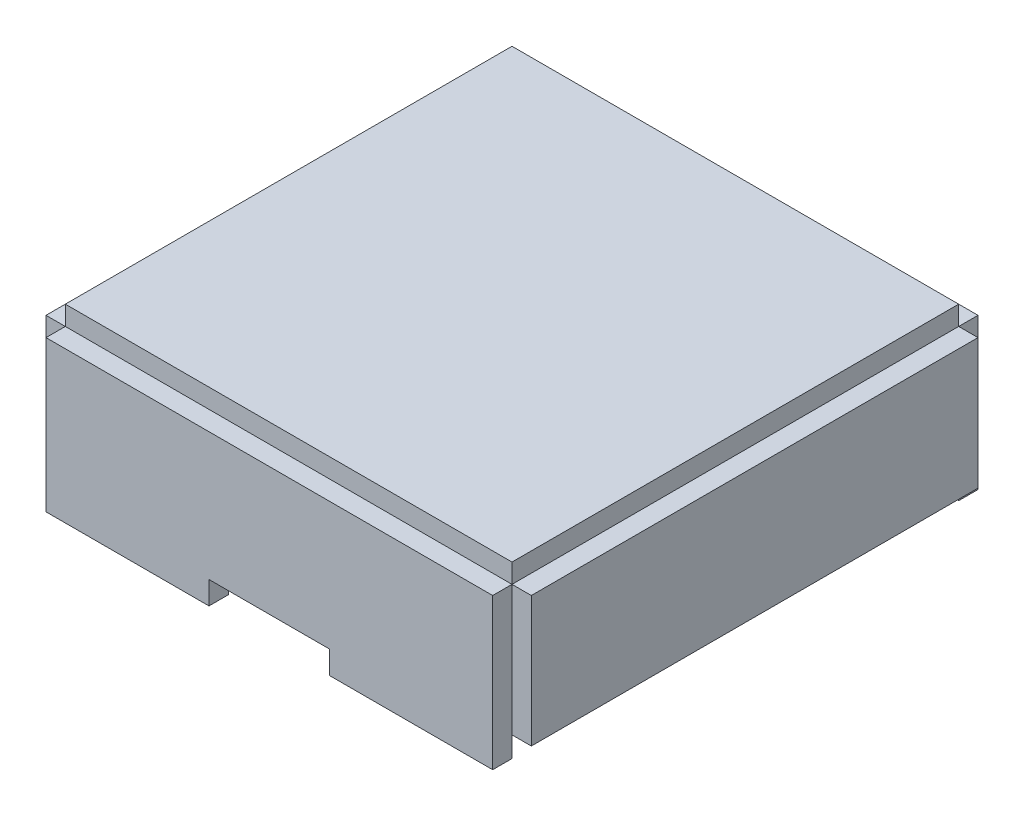
ISO-10303-21;
HEADER;
FILE_DESCRIPTION(('STEP AP214'),'2;1');
FILE_NAME('part.step','',(''),(''),'','','');
FILE_SCHEMA(('AUTOMOTIVE_DESIGN { 1 0 10303 214 1 1 1 1 }'));
ENDSEC;
DATA;
#1=APPLICATION_CONTEXT('core data for automotive mechanical design processes');
#2=APPLICATION_PROTOCOL_DEFINITION('international standard','automotive_design',2000,#1);
#3=PRODUCT_CONTEXT('',#1,'mechanical');
#4=PRODUCT('Part','Part','',(#3));
#5=PRODUCT_RELATED_PRODUCT_CATEGORY('part','',(#4));
#6=PRODUCT_DEFINITION_FORMATION('','',#4);
#7=PRODUCT_DEFINITION_CONTEXT('part definition',#1,'design');
#8=PRODUCT_DEFINITION('design','',#6,#7);
#9=PRODUCT_DEFINITION_SHAPE('','',#8);
#10=(LENGTH_UNIT() NAMED_UNIT(*) SI_UNIT(.MILLI.,.METRE.));
#11=(NAMED_UNIT(*) PLANE_ANGLE_UNIT() SI_UNIT($,.RADIAN.));
#12=(NAMED_UNIT(*) SI_UNIT($,.STERADIAN.) SOLID_ANGLE_UNIT());
#13=UNCERTAINTY_MEASURE_WITH_UNIT(LENGTH_MEASURE(1.E-05),#10,'distance_accuracy_value','');
#14=(GEOMETRIC_REPRESENTATION_CONTEXT(3) GLOBAL_UNCERTAINTY_ASSIGNED_CONTEXT((#13)) GLOBAL_UNIT_ASSIGNED_CONTEXT((#10,
#11,#12)) REPRESENTATION_CONTEXT('',''));
#15=CARTESIAN_POINT('',(0.,0.,0.));
#16=DIRECTION('',(0.,0.,1.));
#17=DIRECTION('',(1.,0.,0.));
#18=AXIS2_PLACEMENT_3D('',#15,#16,#17);
#19=CARTESIAN_POINT('',(0.,-31.75,0.));
#20=DIRECTION('',(0.,-1.,0.));
#21=DIRECTION('',(0.,0.,-1.));
#22=AXIS2_PLACEMENT_3D('',#19,#20,#21);
#23=PLANE('',#22);
#24=DIRECTION('',(0.,0.,1.));
#25=VECTOR('',#24,1.);
#26=CARTESIAN_POINT('',(-24.8920000000006,-31.75,114.3));
#27=LINE('',#26,#25);
#28=CARTESIAN_POINT('',(-24.8920000000006,-31.75,110.236));
#29=VERTEX_POINT('',#28);
#30=CARTESIAN_POINT('',(-24.8920000000006,-31.75,114.3));
#31=VERTEX_POINT('',#30);
#32=EDGE_CURVE('E129',#29,#31,#27,.T.);
#33=ORIENTED_EDGE('',*,*,#32,.F.);
#34=DIRECTION('',(1.,0.,0.));
#35=VECTOR('',#34,1.);
#36=CARTESIAN_POINT('',(0.,-31.75,110.236));
#37=LINE('',#36,#35);
#38=CARTESIAN_POINT('',(9.39799999999882,-31.75,110.236));
#39=VERTEX_POINT('',#38);
#40=EDGE_CURVE('E159',#29,#39,#37,.T.);
#41=ORIENTED_EDGE('',*,*,#40,.T.);
#42=DIRECTION('',(0.,0.,1.));
#43=VECTOR('',#42,1.);
#44=CARTESIAN_POINT('',(9.3979999999988,-31.75,0.));
#45=LINE('',#44,#43);
#46=CARTESIAN_POINT('',(9.39799999999882,-31.75,114.3));
#47=VERTEX_POINT('',#46);
#48=EDGE_CURVE('E162',#39,#47,#45,.T.);
#49=ORIENTED_EDGE('',*,*,#48,.T.);
#50=DIRECTION('',(1.,0.,0.));
#51=VECTOR('',#50,1.);
#52=CARTESIAN_POINT('',(0.,-31.75,114.3));
#53=LINE('',#52,#51);
#54=EDGE_CURVE('E165',#31,#47,#53,.T.);
#55=ORIENTED_EDGE('',*,*,#54,.F.);
#56=EDGE_LOOP('',(#33,#41,#49,#55));
#57=FACE_BOUND('',#56,.T.);
#58=ADVANCED_FACE('F50',(#57),#23,.T.);
#59=CARTESIAN_POINT('',(-84.5820000000005,-31.75,0.));
#60=DIRECTION('',(1.,0.,0.));
#61=DIRECTION('',(0.,0.,-1.));
#62=AXIS2_PLACEMENT_3D('',#59,#60,#61);
#63=PLANE('',#62);
#64=DIRECTION('',(0.,0.,-1.));
#65=VECTOR('',#64,1.);
#66=CARTESIAN_POINT('',(-84.5820000000005,0.,0.));
#67=LINE('',#66,#65);
#68=CARTESIAN_POINT('',(-84.5820000000004,0.,114.3));
#69=VERTEX_POINT('',#68);
#70=CARTESIAN_POINT('',(-84.5820000000004,0.,110.236));
#71=VERTEX_POINT('',#70);
#72=EDGE_CURVE('E153',#69,#71,#67,.T.);
#73=ORIENTED_EDGE('',*,*,#72,.T.);
#74=DIRECTION('',(0.,1.,0.));
#75=VECTOR('',#74,1.);
#76=CARTESIAN_POINT('',(-84.5820000000004,-31.75,110.236));
#77=LINE('',#76,#75);
#78=CARTESIAN_POINT('',(-84.5820000000004,-31.75,110.236));
#79=VERTEX_POINT('',#78);
#80=EDGE_CURVE('E12',#79,#71,#77,.T.);
#81=ORIENTED_EDGE('',*,*,#80,.F.);
#82=DIRECTION('',(0.,0.,-1.));
#83=VECTOR('',#82,1.);
#84=CARTESIAN_POINT('',(-84.5820000000005,-31.75,0.));
#85=LINE('',#84,#83);
#86=CARTESIAN_POINT('',(-84.5820000000004,-31.75,114.3));
#87=VERTEX_POINT('',#86);
#88=EDGE_CURVE('E157',#87,#79,#85,.T.);
#89=ORIENTED_EDGE('',*,*,#88,.F.);
#90=DIRECTION('',(0.,1.,0.));
#91=VECTOR('',#90,1.);
#92=CARTESIAN_POINT('',(-84.5820000000004,-31.75,114.3));
#93=LINE('',#92,#91);
#94=EDGE_CURVE('E74',#87,#69,#93,.T.);
#95=ORIENTED_EDGE('',*,*,#94,.T.);
#96=EDGE_LOOP('',(#73,#81,#89,#95));
#97=FACE_BOUND('',#96,.T.);
#98=ADVANCED_FACE('F52',(#97),#63,.F.);
#99=CARTESIAN_POINT('',(0.,-31.75,110.236));
#100=DIRECTION('',(0.,0.,1.));
#101=DIRECTION('',(1.,0.,0.));
#102=AXIS2_PLACEMENT_3D('',#99,#100,#101);
#103=PLANE('',#102);
#104=ORIENTED_EDGE('',*,*,#40,.F.);
#105=DIRECTION('',(0.,-1.,0.));
#106=VECTOR('',#105,1.);
#107=CARTESIAN_POINT('',(-24.8920000000006,-26.924,110.236));
#108=LINE('',#107,#106);
#109=CARTESIAN_POINT('',(-24.8920000000006,-26.924,110.236));
#110=VERTEX_POINT('',#109);
#111=EDGE_CURVE('E151',#110,#29,#108,.T.);
#112=ORIENTED_EDGE('',*,*,#111,.F.);
#113=DIRECTION('',(1.,0.,0.));
#114=VECTOR('',#113,1.);
#115=CARTESIAN_POINT('',(-50.2920000000006,-26.924,110.236));
#116=LINE('',#115,#114);
#117=CARTESIAN_POINT('',(-50.2920000000006,-26.924,110.236));
#118=VERTEX_POINT('',#117);
#119=EDGE_CURVE('E132',#118,#110,#116,.T.);
#120=ORIENTED_EDGE('',*,*,#119,.F.);
#121=DIRECTION('',(0.,-1.,0.));
#122=VECTOR('',#121,1.);
#123=CARTESIAN_POINT('',(-50.2920000000006,-26.924,110.236));
#124=LINE('',#123,#122);
#125=CARTESIAN_POINT('',(-50.2920000000006,-31.75,110.236));
#126=VERTEX_POINT('',#125);
#127=EDGE_CURVE('E154',#118,#126,#124,.T.);
#128=ORIENTED_EDGE('',*,*,#127,.T.);
#129=EDGE_CURVE('E100',#79,#126,#37,.T.);
#130=ORIENTED_EDGE('',*,*,#129,.F.);
#131=ORIENTED_EDGE('',*,*,#80,.T.);
#132=DIRECTION('',(1.,0.,0.));
#133=VECTOR('',#132,1.);
#134=CARTESIAN_POINT('',(0.,0.,110.236));
#135=LINE('',#134,#133);
#136=CARTESIAN_POINT('',(9.39799999999882,0.,110.236));
#137=VERTEX_POINT('',#136);
#138=EDGE_CURVE('E169',#71,#137,#135,.T.);
#139=ORIENTED_EDGE('',*,*,#138,.T.);
#140=DIRECTION('',(0.,1.,0.));
#141=VECTOR('',#140,1.);
#142=CARTESIAN_POINT('',(9.39799999999882,-31.75,110.236));
#143=LINE('',#142,#141);
#144=EDGE_CURVE('E58',#39,#137,#143,.T.);
#145=ORIENTED_EDGE('',*,*,#144,.F.);
#146=EDGE_LOOP('',(#104,#112,#120,#128,#130,#131,#139,#145));
#147=FACE_BOUND('',#146,.T.);
#148=ADVANCED_FACE('F189',(#147),#103,.F.);
#149=CARTESIAN_POINT('',(9.3979999999988,-31.75,0.));
#150=DIRECTION('',(-1.,0.,0.));
#151=DIRECTION('',(0.,0.,1.));
#152=AXIS2_PLACEMENT_3D('',#149,#150,#151);
#153=PLANE('',#152);
#154=DIRECTION('',(0.,0.,1.));
#155=VECTOR('',#154,1.);
#156=CARTESIAN_POINT('',(9.3979999999988,0.,0.));
#157=LINE('',#156,#155);
#158=CARTESIAN_POINT('',(9.39799999999882,0.,114.3));
#159=VERTEX_POINT('',#158);
#160=EDGE_CURVE('E171',#137,#159,#157,.T.);
#161=ORIENTED_EDGE('',*,*,#160,.T.);
#162=DIRECTION('',(0.,1.,0.));
#163=VECTOR('',#162,1.);
#164=CARTESIAN_POINT('',(9.39799999999882,-31.75,114.3));
#165=LINE('',#164,#163);
#166=EDGE_CURVE('E177',#47,#159,#165,.T.);
#167=ORIENTED_EDGE('',*,*,#166,.F.);
#168=ORIENTED_EDGE('',*,*,#48,.F.);
#169=ORIENTED_EDGE('',*,*,#144,.T.);
#170=EDGE_LOOP('',(#161,#167,#168,#169));
#171=FACE_BOUND('',#170,.T.);
#172=ADVANCED_FACE('F183',(#171),#153,.F.);
#173=CARTESIAN_POINT('',(0.,-31.75,114.3));
#174=DIRECTION('',(0.,0.,1.));
#175=DIRECTION('',(1.,0.,0.));
#176=AXIS2_PLACEMENT_3D('',#173,#174,#175);
#177=PLANE('',#176);
#178=DIRECTION('',(0.,-1.,0.));
#179=VECTOR('',#178,1.);
#180=CARTESIAN_POINT('',(-24.8920000000006,-26.924,114.3));
#181=LINE('',#180,#179);
#182=CARTESIAN_POINT('',(-24.8920000000006,-26.924,114.3));
#183=VERTEX_POINT('',#182);
#184=EDGE_CURVE('E123',#183,#31,#181,.T.);
#185=ORIENTED_EDGE('',*,*,#184,.T.);
#186=ORIENTED_EDGE('',*,*,#54,.T.);
#187=ORIENTED_EDGE('',*,*,#166,.T.);
#188=DIRECTION('',(1.,0.,0.));
#189=VECTOR('',#188,1.);
#190=CARTESIAN_POINT('',(0.,0.,114.3));
#191=LINE('',#190,#189);
#192=EDGE_CURVE('E160',#69,#159,#191,.T.);
#193=ORIENTED_EDGE('',*,*,#192,.F.);
#194=ORIENTED_EDGE('',*,*,#94,.F.);
#195=CARTESIAN_POINT('',(-50.2920000000006,-31.75,114.3));
#196=VERTEX_POINT('',#195);
#197=EDGE_CURVE('E166',#87,#196,#53,.T.);
#198=ORIENTED_EDGE('',*,*,#197,.T.);
#199=DIRECTION('',(0.,-1.,0.));
#200=VECTOR('',#199,1.);
#201=CARTESIAN_POINT('',(-50.2920000000006,-26.924,114.3));
#202=LINE('',#201,#200);
#203=CARTESIAN_POINT('',(-50.2920000000006,-26.924,114.3));
#204=VERTEX_POINT('',#203);
#205=EDGE_CURVE('E65',#204,#196,#202,.T.);
#206=ORIENTED_EDGE('',*,*,#205,.F.);
#207=DIRECTION('',(-1.,0.,0.));
#208=VECTOR('',#207,1.);
#209=CARTESIAN_POINT('',(-50.2920000000006,-26.924,114.3));
#210=LINE('',#209,#208);
#211=EDGE_CURVE('E138',#183,#204,#210,.T.);
#212=ORIENTED_EDGE('',*,*,#211,.F.);
#213=EDGE_LOOP('',(#185,#186,#187,#193,#194,#198,#206,#212));
#214=FACE_BOUND('',#213,.T.);
#215=ADVANCED_FACE('F143',(#214),#177,.T.);
#216=DIRECTION('',(0.,0.,-1.));
#217=VECTOR('',#216,1.);
#218=CARTESIAN_POINT('',(-50.2920000000006,-31.75,114.3));
#219=LINE('',#218,#217);
#220=EDGE_CURVE('E141',#196,#126,#219,.T.);
#221=ORIENTED_EDGE('',*,*,#220,.F.);
#222=ORIENTED_EDGE('',*,*,#197,.F.);
#223=ORIENTED_EDGE('',*,*,#88,.T.);
#224=ORIENTED_EDGE('',*,*,#129,.T.);
#225=EDGE_LOOP('',(#221,#222,#223,#224));
#226=FACE_BOUND('',#225,.T.);
#227=ADVANCED_FACE('F191',(#226),#23,.T.);
#228=CARTESIAN_POINT('',(0.,0.,0.));
#229=DIRECTION('',(0.,-1.,0.));
#230=DIRECTION('',(0.,0.,-1.));
#231=AXIS2_PLACEMENT_3D('',#228,#229,#230);
#232=PLANE('',#231);
#233=ORIENTED_EDGE('',*,*,#72,.F.);
#234=ORIENTED_EDGE('',*,*,#192,.T.);
#235=ORIENTED_EDGE('',*,*,#160,.F.);
#236=ORIENTED_EDGE('',*,*,#138,.F.);
#237=EDGE_LOOP('',(#233,#234,#235,#236));
#238=FACE_BOUND('',#237,.T.);
#239=ADVANCED_FACE('F187',(#238),#232,.F.);
#240=CARTESIAN_POINT('',(-24.8920000000006,-26.924,114.3));
#241=DIRECTION('',(1.,0.,0.));
#242=DIRECTION('',(0.,0.,-1.));
#243=AXIS2_PLACEMENT_3D('',#240,#241,#242);
#244=PLANE('',#243);
#245=ORIENTED_EDGE('',*,*,#32,.T.);
#246=ORIENTED_EDGE('',*,*,#184,.F.);
#247=DIRECTION('',(0.,0.,1.));
#248=VECTOR('',#247,1.);
#249=CARTESIAN_POINT('',(-24.8920000000006,-26.924,114.3));
#250=LINE('',#249,#248);
#251=EDGE_CURVE('E126',#110,#183,#250,.T.);
#252=ORIENTED_EDGE('',*,*,#251,.F.);
#253=ORIENTED_EDGE('',*,*,#111,.T.);
#254=EDGE_LOOP('',(#245,#246,#252,#253));
#255=FACE_BOUND('',#254,.T.);
#256=ADVANCED_FACE('F125',(#255),#244,.F.);
#257=CARTESIAN_POINT('',(-50.2920000000006,-26.924,114.3));
#258=DIRECTION('',(-1.,0.,0.));
#259=DIRECTION('',(0.,0.,1.));
#260=AXIS2_PLACEMENT_3D('',#257,#258,#259);
#261=PLANE('',#260);
#262=ORIENTED_EDGE('',*,*,#220,.T.);
#263=ORIENTED_EDGE('',*,*,#127,.F.);
#264=DIRECTION('',(0.,0.,-1.));
#265=VECTOR('',#264,1.);
#266=CARTESIAN_POINT('',(-50.2920000000006,-26.924,114.3));
#267=LINE('',#266,#265);
#268=EDGE_CURVE('E144',#204,#118,#267,.T.);
#269=ORIENTED_EDGE('',*,*,#268,.F.);
#270=ORIENTED_EDGE('',*,*,#205,.T.);
#271=EDGE_LOOP('',(#262,#263,#269,#270));
#272=FACE_BOUND('',#271,.T.);
#273=ADVANCED_FACE('F243',(#272),#261,.F.);
#274=CARTESIAN_POINT('',(0.,-26.924,0.));
#275=DIRECTION('',(0.,-1.,0.));
#276=DIRECTION('',(0.,0.,-1.));
#277=AXIS2_PLACEMENT_3D('',#274,#275,#276);
#278=PLANE('',#277);
#279=ORIENTED_EDGE('',*,*,#251,.T.);
#280=ORIENTED_EDGE('',*,*,#211,.T.);
#281=ORIENTED_EDGE('',*,*,#268,.T.);
#282=ORIENTED_EDGE('',*,*,#119,.T.);
#283=EDGE_LOOP('',(#279,#280,#281,#282));
#284=FACE_BOUND('',#283,.T.);
#285=ADVANCED_FACE('F136',(#284),#278,.T.);
#286=CLOSED_SHELL('',(#58,#98,#148,#172,#215,#227,#239,#256,#273,#285));
#287=MANIFOLD_SOLID_BREP('B2',#286);
#288=CARTESIAN_POINT('',(13.4619999999988,-31.75,0.));
#289=DIRECTION('',(1.,0.,0.));
#290=DIRECTION('',(0.,0.,-1.));
#291=AXIS2_PLACEMENT_3D('',#288,#289,#290);
#292=PLANE('',#291);
#293=DIRECTION('',(0.,1.,0.));
#294=VECTOR('',#293,1.);
#295=CARTESIAN_POINT('',(13.4619999999988,-31.75,208.28));
#296=LINE('',#295,#294);
#297=CARTESIAN_POINT('',(13.4619999999988,-27.432,208.28));
#298=VERTEX_POINT('',#297);
#299=CARTESIAN_POINT('',(13.4619999999988,0.,208.28));
#300=VERTEX_POINT('',#299);
#301=EDGE_CURVE('E48',#298,#300,#296,.T.);
#302=ORIENTED_EDGE('',*,*,#301,.F.);
#303=DIRECTION('',(0.,0.,1.));
#304=VECTOR('',#303,1.);
#305=CARTESIAN_POINT('',(13.4619999999988,-27.432,114.3));
#306=LINE('',#305,#304);
#307=CARTESIAN_POINT('',(13.4619999999988,-27.432,114.3));
#308=VERTEX_POINT('',#307);
#309=EDGE_CURVE('E331',#308,#298,#306,.T.);
#310=ORIENTED_EDGE('',*,*,#309,.F.);
#311=DIRECTION('',(0.,1.,0.));
#312=VECTOR('',#311,1.);
#313=CARTESIAN_POINT('',(13.4619999999988,-31.75,114.3));
#314=LINE('',#313,#312);
#315=CARTESIAN_POINT('',(13.4619999999988,0.,114.3));
#316=VERTEX_POINT('',#315);
#317=EDGE_CURVE('E313',#308,#316,#314,.T.);
#318=ORIENTED_EDGE('',*,*,#317,.T.);
#319=DIRECTION('',(0.,0.,-1.));
#320=VECTOR('',#319,1.);
#321=CARTESIAN_POINT('',(13.4619999999988,0.,0.));
#322=LINE('',#321,#320);
#323=EDGE_CURVE('E360',#300,#316,#322,.T.);
#324=ORIENTED_EDGE('',*,*,#323,.F.);
#325=EDGE_LOOP('',(#302,#310,#318,#324));
#326=FACE_BOUND('',#325,.T.);
#327=ADVANCED_FACE('F291',(#326),#292,.T.);
#328=CARTESIAN_POINT('',(0.,-31.75,208.28));
#329=DIRECTION('',(0.,0.,-1.));
#330=DIRECTION('',(-1.,0.,0.));
#331=AXIS2_PLACEMENT_3D('',#328,#329,#330);
#332=PLANE('',#331);
#333=DIRECTION('',(-1.,0.,0.));
#334=VECTOR('',#333,1.);
#335=CARTESIAN_POINT('',(13.4619999999988,-27.432,208.28));
#336=LINE('',#335,#334);
#337=CARTESIAN_POINT('',(9.39799999999879,-27.432,208.28));
#338=VERTEX_POINT('',#337);
#339=EDGE_CURVE('E337',#298,#338,#336,.T.);
#340=ORIENTED_EDGE('',*,*,#339,.F.);
#341=ORIENTED_EDGE('',*,*,#301,.T.);
#342=DIRECTION('',(-1.,0.,0.));
#343=VECTOR('',#342,1.);
#344=CARTESIAN_POINT('',(0.,0.,208.28));
#345=LINE('',#344,#343);
#346=CARTESIAN_POINT('',(9.39799999999879,0.,208.28));
#347=VERTEX_POINT('',#346);
#348=EDGE_CURVE('E357',#300,#347,#345,.T.);
#349=ORIENTED_EDGE('',*,*,#348,.T.);
#350=DIRECTION('',(0.,1.,0.));
#351=VECTOR('',#350,1.);
#352=CARTESIAN_POINT('',(9.39799999999879,-31.75,208.28));
#353=LINE('',#352,#351);
#354=EDGE_CURVE('E298',#338,#347,#353,.T.);
#355=ORIENTED_EDGE('',*,*,#354,.F.);
#356=EDGE_LOOP('',(#340,#341,#349,#355));
#357=FACE_BOUND('',#356,.T.);
#358=ADVANCED_FACE('F358',(#357),#332,.F.);
#359=CARTESIAN_POINT('',(9.39799999999889,-31.75,0.));
#360=DIRECTION('',(1.,0.,0.));
#361=DIRECTION('',(0.,0.,-1.));
#362=AXIS2_PLACEMENT_3D('',#359,#360,#361);
#363=PLANE('',#362);
#364=DIRECTION('',(0.,0.,-1.));
#365=VECTOR('',#364,1.);
#366=CARTESIAN_POINT('',(9.39799999999879,-27.432,208.28));
#367=LINE('',#366,#365);
#368=CARTESIAN_POINT('',(9.39799999999882,-27.432,114.3));
#369=VERTEX_POINT('',#368);
#370=EDGE_CURVE('E305',#338,#369,#367,.T.);
#371=ORIENTED_EDGE('',*,*,#370,.F.);
#372=ORIENTED_EDGE('',*,*,#354,.T.);
#373=DIRECTION('',(0.,0.,-1.));
#374=VECTOR('',#373,1.);
#375=CARTESIAN_POINT('',(9.39799999999889,0.,0.));
#376=LINE('',#375,#374);
#377=CARTESIAN_POINT('',(9.39799999999882,0.,114.3));
#378=VERTEX_POINT('',#377);
#379=EDGE_CURVE('E346',#347,#378,#376,.T.);
#380=ORIENTED_EDGE('',*,*,#379,.T.);
#381=DIRECTION('',(0.,1.,0.));
#382=VECTOR('',#381,1.);
#383=CARTESIAN_POINT('',(9.39799999999882,-31.75,114.3));
#384=LINE('',#383,#382);
#385=EDGE_CURVE('E343',#369,#378,#384,.T.);
#386=ORIENTED_EDGE('',*,*,#385,.F.);
#387=EDGE_LOOP('',(#371,#372,#380,#386));
#388=FACE_BOUND('',#387,.T.);
#389=ADVANCED_FACE('F353',(#388),#363,.F.);
#390=CARTESIAN_POINT('',(0.,-31.75,114.3));
#391=DIRECTION('',(0.,0.,1.));
#392=DIRECTION('',(1.,0.,0.));
#393=AXIS2_PLACEMENT_3D('',#390,#391,#392);
#394=PLANE('',#393);
#395=DIRECTION('',(1.,0.,0.));
#396=VECTOR('',#395,1.);
#397=CARTESIAN_POINT('',(9.39799999999882,-27.432,114.3));
#398=LINE('',#397,#396);
#399=EDGE_CURVE('E329',#369,#308,#398,.T.);
#400=ORIENTED_EDGE('',*,*,#399,.F.);
#401=ORIENTED_EDGE('',*,*,#385,.T.);
#402=DIRECTION('',(1.,0.,0.));
#403=VECTOR('',#402,1.);
#404=CARTESIAN_POINT('',(0.,0.,114.3));
#405=LINE('',#404,#403);
#406=EDGE_CURVE('E341',#378,#316,#405,.T.);
#407=ORIENTED_EDGE('',*,*,#406,.T.);
#408=ORIENTED_EDGE('',*,*,#317,.F.);
#409=EDGE_LOOP('',(#400,#401,#407,#408));
#410=FACE_BOUND('',#409,.T.);
#411=ADVANCED_FACE('F339',(#410),#394,.F.);
#412=CARTESIAN_POINT('',(0.,0.,0.));
#413=DIRECTION('',(0.,-1.,0.));
#414=DIRECTION('',(0.,0.,-1.));
#415=AXIS2_PLACEMENT_3D('',#412,#413,#414);
#416=PLANE('',#415);
#417=ORIENTED_EDGE('',*,*,#323,.T.);
#418=ORIENTED_EDGE('',*,*,#406,.F.);
#419=ORIENTED_EDGE('',*,*,#379,.F.);
#420=ORIENTED_EDGE('',*,*,#348,.F.);
#421=EDGE_LOOP('',(#417,#418,#419,#420));
#422=FACE_BOUND('',#421,.T.);
#423=ADVANCED_FACE('F362',(#422),#416,.F.);
#424=CARTESIAN_POINT('',(0.,-27.432,0.));
#425=DIRECTION('',(0.,-1.,0.));
#426=DIRECTION('',(0.,0.,-1.));
#427=AXIS2_PLACEMENT_3D('',#424,#425,#426);
#428=PLANE('',#427);
#429=ORIENTED_EDGE('',*,*,#399,.T.);
#430=ORIENTED_EDGE('',*,*,#309,.T.);
#431=ORIENTED_EDGE('',*,*,#339,.T.);
#432=ORIENTED_EDGE('',*,*,#370,.T.);
#433=EDGE_LOOP('',(#429,#430,#431,#432));
#434=FACE_BOUND('',#433,.T.);
#435=ADVANCED_FACE('F330',(#434),#428,.T.);
#436=CLOSED_SHELL('',(#327,#358,#389,#411,#423,#435));
#437=MANIFOLD_SOLID_BREP('B6',#436);
#438=CARTESIAN_POINT('',(0.,-31.75,0.));
#439=DIRECTION('',(0.,-1.,0.));
#440=DIRECTION('',(0.,0.,-1.));
#441=AXIS2_PLACEMENT_3D('',#438,#439,#440);
#442=PLANE('',#441);
#443=DIRECTION('',(0.,0.,1.));
#444=VECTOR('',#443,1.);
#445=CARTESIAN_POINT('',(-24.8920000000008,-31.75,212.344));
#446=LINE('',#445,#444);
#447=CARTESIAN_POINT('',(-24.8920000000008,-31.75,208.28));
#448=VERTEX_POINT('',#447);
#449=CARTESIAN_POINT('',(-24.8920000000008,-31.75,212.344));
#450=VERTEX_POINT('',#449);
#451=EDGE_CURVE('E509',#448,#450,#446,.T.);
#452=ORIENTED_EDGE('',*,*,#451,.F.);
#453=DIRECTION('',(-1.,0.,0.));
#454=VECTOR('',#453,1.);
#455=CARTESIAN_POINT('',(0.,-31.75,208.28));
#456=LINE('',#455,#454);
#457=CARTESIAN_POINT('',(9.39799999999879,-31.75,208.28));
#458=VERTEX_POINT('',#457);
#459=EDGE_CURVE('E547',#458,#448,#456,.T.);
#460=ORIENTED_EDGE('',*,*,#459,.F.);
#461=DIRECTION('',(0.,0.,1.));
#462=VECTOR('',#461,1.);
#463=CARTESIAN_POINT('',(9.39799999999897,-31.75,0.));
#464=LINE('',#463,#462);
#465=CARTESIAN_POINT('',(9.39799999999879,-31.75,212.344));
#466=VERTEX_POINT('',#465);
#467=EDGE_CURVE('E538',#458,#466,#464,.T.);
#468=ORIENTED_EDGE('',*,*,#467,.T.);
#469=DIRECTION('',(-1.,0.,0.));
#470=VECTOR('',#469,1.);
#471=CARTESIAN_POINT('',(0.,-31.75,212.344));
#472=LINE('',#471,#470);
#473=EDGE_CURVE('E481',#466,#450,#472,.T.);
#474=ORIENTED_EDGE('',*,*,#473,.T.);
#475=EDGE_LOOP('',(#452,#460,#468,#474));
#476=FACE_BOUND('',#475,.T.);
#477=ADVANCED_FACE('F431',(#476),#442,.T.);
#478=CARTESIAN_POINT('',(9.39799999999897,-31.75,0.));
#479=DIRECTION('',(-1.,0.,0.));
#480=DIRECTION('',(0.,0.,1.));
#481=AXIS2_PLACEMENT_3D('',#478,#479,#480);
#482=PLANE('',#481);
#483=DIRECTION('',(0.,0.,1.));
#484=VECTOR('',#483,1.);
#485=CARTESIAN_POINT('',(9.39799999999897,0.,0.));
#486=LINE('',#485,#484);
#487=CARTESIAN_POINT('',(9.39799999999879,0.,208.28));
#488=VERTEX_POINT('',#487);
#489=CARTESIAN_POINT('',(9.39799999999879,0.,212.344));
#490=VERTEX_POINT('',#489);
#491=EDGE_CURVE('E533',#488,#490,#486,.T.);
#492=ORIENTED_EDGE('',*,*,#491,.T.);
#493=DIRECTION('',(0.,1.,0.));
#494=VECTOR('',#493,1.);
#495=CARTESIAN_POINT('',(9.39799999999879,-31.75,212.344));
#496=LINE('',#495,#494);
#497=EDGE_CURVE('E289',#466,#490,#496,.T.);
#498=ORIENTED_EDGE('',*,*,#497,.F.);
#499=ORIENTED_EDGE('',*,*,#467,.F.);
#500=DIRECTION('',(0.,1.,0.));
#501=VECTOR('',#500,1.);
#502=CARTESIAN_POINT('',(9.39799999999879,-31.75,208.28));
#503=LINE('',#502,#501);
#504=EDGE_CURVE('E455',#458,#488,#503,.T.);
#505=ORIENTED_EDGE('',*,*,#504,.T.);
#506=EDGE_LOOP('',(#492,#498,#499,#505));
#507=FACE_BOUND('',#506,.T.);
#508=ADVANCED_FACE('F433',(#507),#482,.F.);
#509=CARTESIAN_POINT('',(0.,-31.75,212.344));
#510=DIRECTION('',(0.,0.,-1.));
#511=DIRECTION('',(-1.,0.,0.));
#512=AXIS2_PLACEMENT_3D('',#509,#510,#511);
#513=PLANE('',#512);
#514=DIRECTION('',(-1.,0.,0.));
#515=VECTOR('',#514,1.);
#516=CARTESIAN_POINT('',(-50.2920000000008,-26.924,212.344));
#517=LINE('',#516,#515);
#518=CARTESIAN_POINT('',(-24.8920000000008,-26.924,212.344));
#519=VERTEX_POINT('',#518);
#520=CARTESIAN_POINT('',(-50.2920000000008,-26.924,212.344));
#521=VERTEX_POINT('',#520);
#522=EDGE_CURVE('E517',#519,#521,#517,.T.);
#523=ORIENTED_EDGE('',*,*,#522,.F.);
#524=DIRECTION('',(0.,-1.,0.));
#525=VECTOR('',#524,1.);
#526=CARTESIAN_POINT('',(-24.8920000000008,-26.924,212.344));
#527=LINE('',#526,#525);
#528=EDGE_CURVE('E503',#519,#450,#527,.T.);
#529=ORIENTED_EDGE('',*,*,#528,.T.);
#530=ORIENTED_EDGE('',*,*,#473,.F.);
#531=ORIENTED_EDGE('',*,*,#497,.T.);
#532=DIRECTION('',(-1.,0.,0.));
#533=VECTOR('',#532,1.);
#534=CARTESIAN_POINT('',(0.,0.,212.344));
#535=LINE('',#534,#533);
#536=CARTESIAN_POINT('',(-84.5820000000004,0.,212.344));
#537=VERTEX_POINT('',#536);
#538=EDGE_CURVE('E550',#490,#537,#535,.T.);
#539=ORIENTED_EDGE('',*,*,#538,.T.);
#540=DIRECTION('',(0.,1.,0.));
#541=VECTOR('',#540,1.);
#542=CARTESIAN_POINT('',(-84.5820000000004,-31.75,212.344));
#543=LINE('',#542,#541);
#544=CARTESIAN_POINT('',(-84.5820000000004,-31.75,212.344));
#545=VERTEX_POINT('',#544);
#546=EDGE_CURVE('E439',#545,#537,#543,.T.);
#547=ORIENTED_EDGE('',*,*,#546,.F.);
#548=CARTESIAN_POINT('',(-50.2920000000008,-31.75,212.344));
#549=VERTEX_POINT('',#548);
#550=EDGE_CURVE('E540',#549,#545,#472,.T.);
#551=ORIENTED_EDGE('',*,*,#550,.F.);
#552=DIRECTION('',(0.,-1.,0.));
#553=VECTOR('',#552,1.);
#554=CARTESIAN_POINT('',(-50.2920000000008,-26.924,212.344));
#555=LINE('',#554,#553);
#556=EDGE_CURVE('E446',#521,#549,#555,.T.);
#557=ORIENTED_EDGE('',*,*,#556,.F.);
#558=EDGE_LOOP('',(#523,#529,#530,#531,#539,#547,#551,#557));
#559=FACE_BOUND('',#558,.T.);
#560=ADVANCED_FACE('F522',(#559),#513,.F.);
#561=CARTESIAN_POINT('',(-84.5820000000005,-31.75,0.));
#562=DIRECTION('',(1.,0.,0.));
#563=DIRECTION('',(0.,0.,-1.));
#564=AXIS2_PLACEMENT_3D('',#561,#562,#563);
#565=PLANE('',#564);
#566=DIRECTION('',(0.,0.,-1.));
#567=VECTOR('',#566,1.);
#568=CARTESIAN_POINT('',(-84.5820000000005,0.,0.));
#569=LINE('',#568,#567);
#570=CARTESIAN_POINT('',(-84.5820000000004,0.,208.28));
#571=VERTEX_POINT('',#570);
#572=EDGE_CURVE('E552',#537,#571,#569,.T.);
#573=ORIENTED_EDGE('',*,*,#572,.T.);
#574=DIRECTION('',(0.,1.,0.));
#575=VECTOR('',#574,1.);
#576=CARTESIAN_POINT('',(-84.5820000000004,-31.75,208.28));
#577=LINE('',#576,#575);
#578=CARTESIAN_POINT('',(-84.5820000000004,-31.75,208.28));
#579=VERTEX_POINT('',#578);
#580=EDGE_CURVE('E558',#579,#571,#577,.T.);
#581=ORIENTED_EDGE('',*,*,#580,.F.);
#582=DIRECTION('',(0.,0.,-1.));
#583=VECTOR('',#582,1.);
#584=CARTESIAN_POINT('',(-84.5820000000005,-31.75,0.));
#585=LINE('',#584,#583);
#586=EDGE_CURVE('E543',#545,#579,#585,.T.);
#587=ORIENTED_EDGE('',*,*,#586,.F.);
#588=ORIENTED_EDGE('',*,*,#546,.T.);
#589=EDGE_LOOP('',(#573,#581,#587,#588));
#590=FACE_BOUND('',#589,.T.);
#591=ADVANCED_FACE('F564',(#590),#565,.F.);
#592=CARTESIAN_POINT('',(0.,-31.75,208.28));
#593=DIRECTION('',(0.,0.,-1.));
#594=DIRECTION('',(-1.,0.,0.));
#595=AXIS2_PLACEMENT_3D('',#592,#593,#594);
#596=PLANE('',#595);
#597=DIRECTION('',(0.,-1.,0.));
#598=VECTOR('',#597,1.);
#599=CARTESIAN_POINT('',(-24.8920000000008,-26.924,208.28));
#600=LINE('',#599,#598);
#601=CARTESIAN_POINT('',(-24.8920000000008,-26.924,208.28));
#602=VERTEX_POINT('',#601);
#603=EDGE_CURVE('E531',#602,#448,#600,.T.);
#604=ORIENTED_EDGE('',*,*,#603,.F.);
#605=DIRECTION('',(1.,0.,0.));
#606=VECTOR('',#605,1.);
#607=CARTESIAN_POINT('',(-50.2920000000008,-26.924,208.28));
#608=LINE('',#607,#606);
#609=CARTESIAN_POINT('',(-50.2920000000008,-26.924,208.28));
#610=VERTEX_POINT('',#609);
#611=EDGE_CURVE('E511',#610,#602,#608,.T.);
#612=ORIENTED_EDGE('',*,*,#611,.F.);
#613=DIRECTION('',(0.,-1.,0.));
#614=VECTOR('',#613,1.);
#615=CARTESIAN_POINT('',(-50.2920000000008,-26.924,208.28));
#616=LINE('',#615,#614);
#617=CARTESIAN_POINT('',(-50.2920000000008,-31.75,208.28));
#618=VERTEX_POINT('',#617);
#619=EDGE_CURVE('E534',#610,#618,#616,.T.);
#620=ORIENTED_EDGE('',*,*,#619,.T.);
#621=EDGE_CURVE('E546',#618,#579,#456,.T.);
#622=ORIENTED_EDGE('',*,*,#621,.T.);
#623=ORIENTED_EDGE('',*,*,#580,.T.);
#624=DIRECTION('',(-1.,0.,0.));
#625=VECTOR('',#624,1.);
#626=CARTESIAN_POINT('',(0.,0.,208.28));
#627=LINE('',#626,#625);
#628=EDGE_CURVE('E541',#488,#571,#627,.T.);
#629=ORIENTED_EDGE('',*,*,#628,.F.);
#630=ORIENTED_EDGE('',*,*,#504,.F.);
#631=ORIENTED_EDGE('',*,*,#459,.T.);
#632=EDGE_LOOP('',(#604,#612,#620,#622,#623,#629,#630,#631));
#633=FACE_BOUND('',#632,.T.);
#634=ADVANCED_FACE('F568',(#633),#596,.T.);
#635=DIRECTION('',(0.,0.,-1.));
#636=VECTOR('',#635,1.);
#637=CARTESIAN_POINT('',(-50.2920000000008,-31.75,212.344));
#638=LINE('',#637,#636);
#639=EDGE_CURVE('E520',#549,#618,#638,.T.);
#640=ORIENTED_EDGE('',*,*,#639,.F.);
#641=ORIENTED_EDGE('',*,*,#550,.T.);
#642=ORIENTED_EDGE('',*,*,#586,.T.);
#643=ORIENTED_EDGE('',*,*,#621,.F.);
#644=EDGE_LOOP('',(#640,#641,#642,#643));
#645=FACE_BOUND('',#644,.T.);
#646=ADVANCED_FACE('F571',(#645),#442,.T.);
#647=CARTESIAN_POINT('',(0.,0.,0.));
#648=DIRECTION('',(0.,-1.,0.));
#649=DIRECTION('',(0.,0.,-1.));
#650=AXIS2_PLACEMENT_3D('',#647,#648,#649);
#651=PLANE('',#650);
#652=ORIENTED_EDGE('',*,*,#491,.F.);
#653=ORIENTED_EDGE('',*,*,#628,.T.);
#654=ORIENTED_EDGE('',*,*,#572,.F.);
#655=ORIENTED_EDGE('',*,*,#538,.F.);
#656=EDGE_LOOP('',(#652,#653,#654,#655));
#657=FACE_BOUND('',#656,.T.);
#658=ADVANCED_FACE('F567',(#657),#651,.F.);
#659=CARTESIAN_POINT('',(-24.8920000000008,-26.924,212.344));
#660=DIRECTION('',(1.,0.,0.));
#661=DIRECTION('',(0.,0.,-1.));
#662=AXIS2_PLACEMENT_3D('',#659,#660,#661);
#663=PLANE('',#662);
#664=ORIENTED_EDGE('',*,*,#451,.T.);
#665=ORIENTED_EDGE('',*,*,#528,.F.);
#666=DIRECTION('',(0.,0.,1.));
#667=VECTOR('',#666,1.);
#668=CARTESIAN_POINT('',(-24.8920000000008,-26.924,212.344));
#669=LINE('',#668,#667);
#670=EDGE_CURVE('E506',#602,#519,#669,.T.);
#671=ORIENTED_EDGE('',*,*,#670,.F.);
#672=ORIENTED_EDGE('',*,*,#603,.T.);
#673=EDGE_LOOP('',(#664,#665,#671,#672));
#674=FACE_BOUND('',#673,.T.);
#675=ADVANCED_FACE('F505',(#674),#663,.F.);
#676=CARTESIAN_POINT('',(-50.2920000000008,-26.924,212.344));
#677=DIRECTION('',(-1.,0.,0.));
#678=DIRECTION('',(0.,0.,1.));
#679=AXIS2_PLACEMENT_3D('',#676,#677,#678);
#680=PLANE('',#679);
#681=ORIENTED_EDGE('',*,*,#639,.T.);
#682=ORIENTED_EDGE('',*,*,#619,.F.);
#683=DIRECTION('',(0.,0.,-1.));
#684=VECTOR('',#683,1.);
#685=CARTESIAN_POINT('',(-50.2920000000008,-26.924,212.344));
#686=LINE('',#685,#684);
#687=EDGE_CURVE('E524',#521,#610,#686,.T.);
#688=ORIENTED_EDGE('',*,*,#687,.F.);
#689=ORIENTED_EDGE('',*,*,#556,.T.);
#690=EDGE_LOOP('',(#681,#682,#688,#689));
#691=FACE_BOUND('',#690,.T.);
#692=ADVANCED_FACE('F572',(#691),#680,.F.);
#693=CARTESIAN_POINT('',(0.,-26.924,0.));
#694=DIRECTION('',(0.,-1.,0.));
#695=DIRECTION('',(0.,0.,-1.));
#696=AXIS2_PLACEMENT_3D('',#693,#694,#695);
#697=PLANE('',#696);
#698=ORIENTED_EDGE('',*,*,#670,.T.);
#699=ORIENTED_EDGE('',*,*,#522,.T.);
#700=ORIENTED_EDGE('',*,*,#687,.T.);
#701=ORIENTED_EDGE('',*,*,#611,.T.);
#702=EDGE_LOOP('',(#698,#699,#700,#701));
#703=FACE_BOUND('',#702,.T.);
#704=ADVANCED_FACE('F515',(#703),#697,.T.);
#705=CLOSED_SHELL('',(#477,#508,#560,#591,#634,#646,#658,#675,#692,#704));
#706=MANIFOLD_SOLID_BREP('B42',#705);
#707=CARTESIAN_POINT('',(0.,-31.75,0.));
#708=DIRECTION('',(0.,-1.,0.));
#709=DIRECTION('',(0.,0.,-1.));
#710=AXIS2_PLACEMENT_3D('',#707,#708,#709);
#711=PLANE('',#710);
#712=DIRECTION('',(1.,0.,0.));
#713=VECTOR('',#712,1.);
#714=CARTESIAN_POINT('',(-88.6460000000004,-31.75,148.59));
#715=LINE('',#714,#713);
#716=CARTESIAN_POINT('',(-88.6460000000004,-31.75,148.59));
#717=VERTEX_POINT('',#716);
#718=CARTESIAN_POINT('',(-84.5820000000004,-31.75,148.59));
#719=VERTEX_POINT('',#718);
#720=EDGE_CURVE('E758',#717,#719,#715,.T.);
#721=ORIENTED_EDGE('',*,*,#720,.F.);
#722=DIRECTION('',(0.,0.,-1.));
#723=VECTOR('',#722,1.);
#724=CARTESIAN_POINT('',(-88.6460000000004,-31.75,0.));
#725=LINE('',#724,#723);
#726=CARTESIAN_POINT('',(-88.6460000000004,-31.75,114.3));
#727=VERTEX_POINT('',#726);
#728=EDGE_CURVE('E771',#717,#727,#725,.T.);
#729=ORIENTED_EDGE('',*,*,#728,.T.);
#730=DIRECTION('',(1.,0.,0.));
#731=VECTOR('',#730,1.);
#732=CARTESIAN_POINT('',(0.,-31.75,114.3));
#733=LINE('',#732,#731);
#734=CARTESIAN_POINT('',(-84.5820000000004,-31.75,114.3));
#735=VERTEX_POINT('',#734);
#736=EDGE_CURVE('E774',#727,#735,#733,.T.);
#737=ORIENTED_EDGE('',*,*,#736,.T.);
#738=DIRECTION('',(0.,0.,-1.));
#739=VECTOR('',#738,1.);
#740=CARTESIAN_POINT('',(-84.5820000000004,-31.75,0.));
#741=LINE('',#740,#739);
#742=EDGE_CURVE('E777',#719,#735,#741,.T.);
#743=ORIENTED_EDGE('',*,*,#742,.F.);
#744=EDGE_LOOP('',(#721,#729,#737,#743));
#745=FACE_BOUND('',#744,.T.);
#746=ADVANCED_FACE('F671',(#745),#711,.T.);
#747=CARTESIAN_POINT('',(1.82076576038526E-13,-31.75,208.28));
#748=DIRECTION('',(0.,0.,-1.));
#749=DIRECTION('',(-1.,0.,0.));
#750=AXIS2_PLACEMENT_3D('',#747,#748,#749);
#751=PLANE('',#750);
#752=DIRECTION('',(-1.,0.,0.));
#753=VECTOR('',#752,1.);
#754=CARTESIAN_POINT('',(1.82076576038526E-13,0.,208.28));
#755=LINE('',#754,#753);
#756=CARTESIAN_POINT('',(-84.5820000000004,0.,208.28));
#757=VERTEX_POINT('',#756);
#758=CARTESIAN_POINT('',(-88.6460000000004,0.,208.28));
#759=VERTEX_POINT('',#758);
#760=EDGE_CURVE('E779',#757,#759,#755,.T.);
#761=ORIENTED_EDGE('',*,*,#760,.T.);
#762=DIRECTION('',(0.,1.,0.));
#763=VECTOR('',#762,1.);
#764=CARTESIAN_POINT('',(-88.6460000000004,-31.75,208.28));
#765=LINE('',#764,#763);
#766=CARTESIAN_POINT('',(-88.6460000000004,-31.75,208.28));
#767=VERTEX_POINT('',#766);
#768=EDGE_CURVE('E429',#767,#759,#765,.T.);
#769=ORIENTED_EDGE('',*,*,#768,.F.);
#770=DIRECTION('',(-1.,0.,0.));
#771=VECTOR('',#770,1.);
#772=CARTESIAN_POINT('',(1.82076576038526E-13,-31.75,208.28));
#773=LINE('',#772,#771);
#774=CARTESIAN_POINT('',(-84.5820000000004,-31.75,208.28));
#775=VERTEX_POINT('',#774);
#776=EDGE_CURVE('E769',#775,#767,#773,.T.);
#777=ORIENTED_EDGE('',*,*,#776,.F.);
#778=DIRECTION('',(0.,1.,0.));
#779=VECTOR('',#778,1.);
#780=CARTESIAN_POINT('',(-84.5820000000004,-31.75,208.28));
#781=LINE('',#780,#779);
#782=EDGE_CURVE('E695',#775,#757,#781,.T.);
#783=ORIENTED_EDGE('',*,*,#782,.T.);
#784=EDGE_LOOP('',(#761,#769,#777,#783));
#785=FACE_BOUND('',#784,.T.);
#786=ADVANCED_FACE('F673',(#785),#751,.F.);
#787=CARTESIAN_POINT('',(-88.6460000000004,-31.75,0.));
#788=DIRECTION('',(1.,0.,0.));
#789=DIRECTION('',(0.,0.,-1.));
#790=AXIS2_PLACEMENT_3D('',#787,#788,#789);
#791=PLANE('',#790);
#792=ORIENTED_EDGE('',*,*,#728,.F.);
#793=DIRECTION('',(0.,-1.,0.));
#794=VECTOR('',#793,1.);
#795=CARTESIAN_POINT('',(-88.6460000000004,-26.924,148.59));
#796=LINE('',#795,#794);
#797=CARTESIAN_POINT('',(-88.6460000000004,-26.924,148.59));
#798=VERTEX_POINT('',#797);
#799=EDGE_CURVE('E764',#798,#717,#796,.T.);
#800=ORIENTED_EDGE('',*,*,#799,.F.);
#801=DIRECTION('',(0.,0.,-1.));
#802=VECTOR('',#801,1.);
#803=CARTESIAN_POINT('',(-88.6460000000004,-26.924,148.59));
#804=LINE('',#803,#802);
#805=CARTESIAN_POINT('',(-88.6460000000004,-26.924,173.99));
#806=VERTEX_POINT('',#805);
#807=EDGE_CURVE('E749',#806,#798,#804,.T.);
#808=ORIENTED_EDGE('',*,*,#807,.F.);
#809=DIRECTION('',(0.,-1.,0.));
#810=VECTOR('',#809,1.);
#811=CARTESIAN_POINT('',(-88.6460000000004,-26.924,173.99));
#812=LINE('',#811,#810);
#813=CARTESIAN_POINT('',(-88.6460000000004,-31.75,173.99));
#814=VERTEX_POINT('',#813);
#815=EDGE_CURVE('E746',#806,#814,#812,.T.);
#816=ORIENTED_EDGE('',*,*,#815,.T.);
#817=EDGE_CURVE('E721',#767,#814,#725,.T.);
#818=ORIENTED_EDGE('',*,*,#817,.F.);
#819=ORIENTED_EDGE('',*,*,#768,.T.);
#820=DIRECTION('',(0.,0.,-1.));
#821=VECTOR('',#820,1.);
#822=CARTESIAN_POINT('',(-88.6460000000004,0.,0.));
#823=LINE('',#822,#821);
#824=CARTESIAN_POINT('',(-88.6460000000004,0.,114.3));
#825=VERTEX_POINT('',#824);
#826=EDGE_CURVE('E781',#759,#825,#823,.T.);
#827=ORIENTED_EDGE('',*,*,#826,.T.);
#828=DIRECTION('',(0.,1.,0.));
#829=VECTOR('',#828,1.);
#830=CARTESIAN_POINT('',(-88.6460000000004,-31.75,114.3));
#831=LINE('',#830,#829);
#832=EDGE_CURVE('E679',#727,#825,#831,.T.);
#833=ORIENTED_EDGE('',*,*,#832,.F.);
#834=EDGE_LOOP('',(#792,#800,#808,#816,#818,#819,#827,#833));
#835=FACE_BOUND('',#834,.T.);
#836=ADVANCED_FACE('F805',(#835),#791,.F.);
#837=CARTESIAN_POINT('',(0.,-31.75,114.3));
#838=DIRECTION('',(0.,0.,1.));
#839=DIRECTION('',(1.,0.,0.));
#840=AXIS2_PLACEMENT_3D('',#837,#838,#839);
#841=PLANE('',#840);
#842=DIRECTION('',(1.,0.,0.));
#843=VECTOR('',#842,1.);
#844=CARTESIAN_POINT('',(0.,0.,114.3));
#845=LINE('',#844,#843);
#846=CARTESIAN_POINT('',(-84.5820000000004,0.,114.3));
#847=VERTEX_POINT('',#846);
#848=EDGE_CURVE('E784',#825,#847,#845,.T.);
#849=ORIENTED_EDGE('',*,*,#848,.T.);
#850=DIRECTION('',(0.,1.,0.));
#851=VECTOR('',#850,1.);
#852=CARTESIAN_POINT('',(-84.5820000000004,-31.75,114.3));
#853=LINE('',#852,#851);
#854=EDGE_CURVE('E790',#735,#847,#853,.T.);
#855=ORIENTED_EDGE('',*,*,#854,.F.);
#856=ORIENTED_EDGE('',*,*,#736,.F.);
#857=ORIENTED_EDGE('',*,*,#832,.T.);
#858=EDGE_LOOP('',(#849,#855,#856,#857));
#859=FACE_BOUND('',#858,.T.);
#860=ADVANCED_FACE('F796',(#859),#841,.F.);
#861=CARTESIAN_POINT('',(-84.5820000000004,-31.75,0.));
#862=DIRECTION('',(1.,0.,0.));
#863=DIRECTION('',(0.,0.,-1.));
#864=AXIS2_PLACEMENT_3D('',#861,#862,#863);
#865=PLANE('',#864);
#866=DIRECTION('',(0.,-1.,0.));
#867=VECTOR('',#866,1.);
#868=CARTESIAN_POINT('',(-84.5820000000004,-26.924,148.59));
#869=LINE('',#868,#867);
#870=CARTESIAN_POINT('',(-84.5820000000004,-26.924,148.59));
#871=VERTEX_POINT('',#870);
#872=EDGE_CURVE('E782',#871,#719,#869,.T.);
#873=ORIENTED_EDGE('',*,*,#872,.T.);
#874=ORIENTED_EDGE('',*,*,#742,.T.);
#875=ORIENTED_EDGE('',*,*,#854,.T.);
#876=DIRECTION('',(0.,0.,-1.));
#877=VECTOR('',#876,1.);
#878=CARTESIAN_POINT('',(-84.5820000000004,0.,0.));
#879=LINE('',#878,#877);
#880=EDGE_CURVE('E772',#757,#847,#879,.T.);
#881=ORIENTED_EDGE('',*,*,#880,.F.);
#882=ORIENTED_EDGE('',*,*,#782,.F.);
#883=CARTESIAN_POINT('',(-84.5820000000004,-31.75,173.99));
#884=VERTEX_POINT('',#883);
#885=EDGE_CURVE('E762',#775,#884,#741,.T.);
#886=ORIENTED_EDGE('',*,*,#885,.T.);
#887=DIRECTION('',(0.,-1.,0.));
#888=VECTOR('',#887,1.);
#889=CARTESIAN_POINT('',(-84.5820000000004,-26.924,173.99));
#890=LINE('',#889,#888);
#891=CARTESIAN_POINT('',(-84.5820000000004,-26.924,173.99));
#892=VERTEX_POINT('',#891);
#893=EDGE_CURVE('E686',#892,#884,#890,.T.);
#894=ORIENTED_EDGE('',*,*,#893,.F.);
#895=DIRECTION('',(0.,0.,1.));
#896=VECTOR('',#895,1.);
#897=CARTESIAN_POINT('',(-84.5820000000004,-26.924,148.59));
#898=LINE('',#897,#896);
#899=EDGE_CURVE('E750',#871,#892,#898,.T.);
#900=ORIENTED_EDGE('',*,*,#899,.F.);
#901=EDGE_LOOP('',(#873,#874,#875,#881,#882,#886,#894,#900));
#902=FACE_BOUND('',#901,.T.);
#903=ADVANCED_FACE('F760',(#902),#865,.T.);
#904=DIRECTION('',(-1.,0.,0.));
#905=VECTOR('',#904,1.);
#906=CARTESIAN_POINT('',(-88.6460000000004,-31.75,173.99));
#907=LINE('',#906,#905);
#908=EDGE_CURVE('E810',#884,#814,#907,.T.);
#909=ORIENTED_EDGE('',*,*,#908,.F.);
#910=ORIENTED_EDGE('',*,*,#885,.F.);
#911=ORIENTED_EDGE('',*,*,#776,.T.);
#912=ORIENTED_EDGE('',*,*,#817,.T.);
#913=EDGE_LOOP('',(#909,#910,#911,#912));
#914=FACE_BOUND('',#913,.T.);
#915=ADVANCED_FACE('F820',(#914),#711,.T.);
#916=CARTESIAN_POINT('',(0.,0.,0.));
#917=DIRECTION('',(0.,-1.,0.));
#918=DIRECTION('',(0.,0.,-1.));
#919=AXIS2_PLACEMENT_3D('',#916,#917,#918);
#920=PLANE('',#919);
#921=ORIENTED_EDGE('',*,*,#760,.F.);
#922=ORIENTED_EDGE('',*,*,#880,.T.);
#923=ORIENTED_EDGE('',*,*,#848,.F.);
#924=ORIENTED_EDGE('',*,*,#826,.F.);
#925=EDGE_LOOP('',(#921,#922,#923,#924));
#926=FACE_BOUND('',#925,.T.);
#927=ADVANCED_FACE('F800',(#926),#920,.F.);
#928=CARTESIAN_POINT('',(-88.6460000000004,-26.924,148.59));
#929=DIRECTION('',(0.,0.,-1.));
#930=DIRECTION('',(-1.,0.,0.));
#931=AXIS2_PLACEMENT_3D('',#928,#929,#930);
#932=PLANE('',#931);
#933=ORIENTED_EDGE('',*,*,#720,.T.);
#934=ORIENTED_EDGE('',*,*,#872,.F.);
#935=DIRECTION('',(1.,0.,0.));
#936=VECTOR('',#935,1.);
#937=CARTESIAN_POINT('',(-88.6460000000004,-26.924,148.59));
#938=LINE('',#937,#936);
#939=EDGE_CURVE('E756',#798,#871,#938,.T.);
#940=ORIENTED_EDGE('',*,*,#939,.F.);
#941=ORIENTED_EDGE('',*,*,#799,.T.);
#942=EDGE_LOOP('',(#933,#934,#940,#941));
#943=FACE_BOUND('',#942,.T.);
#944=ADVANCED_FACE('F812',(#943),#932,.F.);
#945=CARTESIAN_POINT('',(-88.6460000000004,-26.924,173.99));
#946=DIRECTION('',(0.,0.,1.));
#947=DIRECTION('',(1.,0.,0.));
#948=AXIS2_PLACEMENT_3D('',#945,#946,#947);
#949=PLANE('',#948);
#950=ORIENTED_EDGE('',*,*,#908,.T.);
#951=ORIENTED_EDGE('',*,*,#815,.F.);
#952=DIRECTION('',(-1.,0.,0.));
#953=VECTOR('',#952,1.);
#954=CARTESIAN_POINT('',(-88.6460000000004,-26.924,173.99));
#955=LINE('',#954,#953);
#956=EDGE_CURVE('E743',#892,#806,#955,.T.);
#957=ORIENTED_EDGE('',*,*,#956,.F.);
#958=ORIENTED_EDGE('',*,*,#893,.T.);
#959=EDGE_LOOP('',(#950,#951,#957,#958));
#960=FACE_BOUND('',#959,.T.);
#961=ADVANCED_FACE('F745',(#960),#949,.F.);
#962=CARTESIAN_POINT('',(0.,-26.924,0.));
#963=DIRECTION('',(0.,1.,0.));
#964=DIRECTION('',(0.,0.,1.));
#965=AXIS2_PLACEMENT_3D('',#962,#963,#964);
#966=PLANE('',#965);
#967=ORIENTED_EDGE('',*,*,#899,.T.);
#968=ORIENTED_EDGE('',*,*,#956,.T.);
#969=ORIENTED_EDGE('',*,*,#807,.T.);
#970=ORIENTED_EDGE('',*,*,#939,.T.);
#971=EDGE_LOOP('',(#967,#968,#969,#970));
#972=FACE_BOUND('',#971,.T.);
#973=ADVANCED_FACE('F754',(#972),#966,.F.);
#974=CLOSED_SHELL('',(#746,#786,#836,#860,#903,#915,#927,#944,#961,#973));
#975=MANIFOLD_SOLID_BREP('B283',#974);
#976=CARTESIAN_POINT('',(0.,0.,0.));
#977=DIRECTION('',(0.,-1.,0.));
#978=DIRECTION('',(0.,0.,-1.));
#979=AXIS2_PLACEMENT_3D('',#976,#977,#978);
#980=PLANE('',#979);
#981=DIRECTION('',(0.,0.,1.));
#982=VECTOR('',#981,1.);
#983=CARTESIAN_POINT('',(-84.5820000000004,0.,114.3));
#984=LINE('',#983,#982);
#985=CARTESIAN_POINT('',(-84.5820000000004,0.,114.3));
#986=VERTEX_POINT('',#985);
#987=CARTESIAN_POINT('',(-84.5820000000004,0.,208.28));
#988=VERTEX_POINT('',#987);
#989=EDGE_CURVE('E955',#986,#988,#984,.T.);
#990=ORIENTED_EDGE('',*,*,#989,.F.);
#991=DIRECTION('',(1.,0.,0.));
#992=VECTOR('',#991,1.);
#993=CARTESIAN_POINT('',(0.,0.,114.3));
#994=LINE('',#993,#992);
#995=CARTESIAN_POINT('',(9.39799999999882,0.,114.3));
#996=VERTEX_POINT('',#995);
#997=EDGE_CURVE('E917',#986,#996,#994,.T.);
#998=ORIENTED_EDGE('',*,*,#997,.T.);
#999=DIRECTION('',(0.,0.,-1.));
#1000=VECTOR('',#999,1.);
#1001=CARTESIAN_POINT('',(9.39799999999879,0.,208.28));
#1002=LINE('',#1001,#1000);
#1003=CARTESIAN_POINT('',(9.39799999999879,0.,208.28));
#1004=VERTEX_POINT('',#1003);
#1005=EDGE_CURVE('E962',#1004,#996,#1002,.T.);
#1006=ORIENTED_EDGE('',*,*,#1005,.F.);
#1007=DIRECTION('',(1.,0.,0.));
#1008=VECTOR('',#1007,1.);
#1009=CARTESIAN_POINT('',(0.,0.,208.28));
#1010=LINE('',#1009,#1008);
#1011=EDGE_CURVE('E964',#988,#1004,#1010,.T.);
#1012=ORIENTED_EDGE('',*,*,#1011,.F.);
#1013=EDGE_LOOP('',(#990,#998,#1006,#1012));
#1014=FACE_BOUND('',#1013,.T.);
#1015=ADVANCED_FACE('F902',(#1014),#980,.T.);
#1016=CARTESIAN_POINT('',(0.,4.064,0.));
#1017=DIRECTION('',(0.,1.,0.));
#1018=DIRECTION('',(0.,0.,1.));
#1019=AXIS2_PLACEMENT_3D('',#1016,#1017,#1018);
#1020=PLANE('',#1019);
#1021=DIRECTION('',(0.,0.,-1.));
#1022=VECTOR('',#1021,1.);
#1023=CARTESIAN_POINT('',(9.39799999999879,4.06400000000001,208.28));
#1024=LINE('',#1023,#1022);
#1025=CARTESIAN_POINT('',(9.39799999999879,4.06400000000001,208.28));
#1026=VERTEX_POINT('',#1025);
#1027=CARTESIAN_POINT('',(9.39799999999882,4.06400000000001,114.3));
#1028=VERTEX_POINT('',#1027);
#1029=EDGE_CURVE('E906',#1026,#1028,#1024,.T.);
#1030=ORIENTED_EDGE('',*,*,#1029,.T.);
#1031=DIRECTION('',(1.,0.,0.));
#1032=VECTOR('',#1031,1.);
#1033=CARTESIAN_POINT('',(0.,4.06400000000001,114.3));
#1034=LINE('',#1033,#1032);
#1035=CARTESIAN_POINT('',(-84.5820000000004,4.06400000000001,114.3));
#1036=VERTEX_POINT('',#1035);
#1037=EDGE_CURVE('E942',#1036,#1028,#1034,.T.);
#1038=ORIENTED_EDGE('',*,*,#1037,.F.);
#1039=DIRECTION('',(0.,0.,1.));
#1040=VECTOR('',#1039,1.);
#1041=CARTESIAN_POINT('',(-84.5820000000004,4.06400000000001,114.3));
#1042=LINE('',#1041,#1040);
#1043=CARTESIAN_POINT('',(-84.5820000000003,4.06400000000001,208.28));
#1044=VERTEX_POINT('',#1043);
#1045=EDGE_CURVE('E669',#1036,#1044,#1042,.T.);
#1046=ORIENTED_EDGE('',*,*,#1045,.T.);
#1047=DIRECTION('',(1.,0.,0.));
#1048=VECTOR('',#1047,1.);
#1049=CARTESIAN_POINT('',(0.,4.06400000000001,208.28));
#1050=LINE('',#1049,#1048);
#1051=EDGE_CURVE('E959',#1044,#1026,#1050,.T.);
#1052=ORIENTED_EDGE('',*,*,#1051,.T.);
#1053=EDGE_LOOP('',(#1030,#1038,#1046,#1052));
#1054=FACE_BOUND('',#1053,.T.);
#1055=ADVANCED_FACE('F904',(#1054),#1020,.T.);
#1056=CARTESIAN_POINT('',(9.39799999999879,223.742284416097,208.28));
#1057=DIRECTION('',(-1.,0.,0.));
#1058=DIRECTION('',(0.,0.,1.));
#1059=AXIS2_PLACEMENT_3D('',#1056,#1057,#1058);
#1060=PLANE('',#1059);
#1061=DIRECTION('',(0.,-1.,0.));
#1062=VECTOR('',#1061,1.);
#1063=CARTESIAN_POINT('',(9.39799999999882,4.06400000000001,114.3));
#1064=LINE('',#1063,#1062);
#1065=EDGE_CURVE('E946',#1028,#996,#1064,.T.);
#1066=ORIENTED_EDGE('',*,*,#1065,.F.);
#1067=ORIENTED_EDGE('',*,*,#1029,.F.);
#1068=DIRECTION('',(0.,-1.,0.));
#1069=VECTOR('',#1068,1.);
#1070=CARTESIAN_POINT('',(9.39799999999879,4.06400000000001,208.28));
#1071=LINE('',#1070,#1069);
#1072=EDGE_CURVE('E958',#1026,#1004,#1071,.T.);
#1073=ORIENTED_EDGE('',*,*,#1072,.T.);
#1074=ORIENTED_EDGE('',*,*,#1005,.T.);
#1075=EDGE_LOOP('',(#1066,#1067,#1073,#1074));
#1076=FACE_BOUND('',#1075,.T.);
#1077=ADVANCED_FACE('F972',(#1076),#1060,.F.);
#1078=CARTESIAN_POINT('',(-84.5820000000004,223.742284416097,114.3));
#1079=DIRECTION('',(1.,0.,0.));
#1080=DIRECTION('',(0.,0.,-1.));
#1081=AXIS2_PLACEMENT_3D('',#1078,#1079,#1080);
#1082=PLANE('',#1081);
#1083=DIRECTION('',(0.,-1.,0.));
#1084=VECTOR('',#1083,1.);
#1085=CARTESIAN_POINT('',(-84.5820000000004,4.06400000000001,114.3));
#1086=LINE('',#1085,#1084);
#1087=EDGE_CURVE('E940',#1036,#986,#1086,.T.);
#1088=ORIENTED_EDGE('',*,*,#1087,.T.);
#1089=ORIENTED_EDGE('',*,*,#989,.T.);
#1090=DIRECTION('',(0.,-1.,0.));
#1091=VECTOR('',#1090,1.);
#1092=CARTESIAN_POINT('',(-84.5820000000004,4.06400000000001,208.28));
#1093=LINE('',#1092,#1091);
#1094=EDGE_CURVE('E954',#1044,#988,#1093,.T.);
#1095=ORIENTED_EDGE('',*,*,#1094,.F.);
#1096=ORIENTED_EDGE('',*,*,#1045,.F.);
#1097=EDGE_LOOP('',(#1088,#1089,#1095,#1096));
#1098=FACE_BOUND('',#1097,.T.);
#1099=ADVANCED_FACE('F952',(#1098),#1082,.F.);
#1100=CARTESIAN_POINT('',(0.,4.06400000000001,208.28));
#1101=DIRECTION('',(0.,0.,-1.));
#1102=DIRECTION('',(-1.,0.,0.));
#1103=AXIS2_PLACEMENT_3D('',#1100,#1101,#1102);
#1104=PLANE('',#1103);
#1105=ORIENTED_EDGE('',*,*,#1011,.T.);
#1106=ORIENTED_EDGE('',*,*,#1072,.F.);
#1107=ORIENTED_EDGE('',*,*,#1051,.F.);
#1108=ORIENTED_EDGE('',*,*,#1094,.T.);
#1109=EDGE_LOOP('',(#1105,#1106,#1107,#1108));
#1110=FACE_BOUND('',#1109,.T.);
#1111=ADVANCED_FACE('F976',(#1110),#1104,.F.);
#1112=CARTESIAN_POINT('',(0.,4.06400000000001,114.3));
#1113=DIRECTION('',(0.,0.,-1.));
#1114=DIRECTION('',(-1.,0.,0.));
#1115=AXIS2_PLACEMENT_3D('',#1112,#1113,#1114);
#1116=PLANE('',#1115);
#1117=ORIENTED_EDGE('',*,*,#997,.F.);
#1118=ORIENTED_EDGE('',*,*,#1087,.F.);
#1119=ORIENTED_EDGE('',*,*,#1037,.T.);
#1120=ORIENTED_EDGE('',*,*,#1065,.T.);
#1121=EDGE_LOOP('',(#1117,#1118,#1119,#1120));
#1122=FACE_BOUND('',#1121,.T.);
#1123=ADVANCED_FACE('F941',(#1122),#1116,.T.);
#1124=CLOSED_SHELL('',(#1015,#1055,#1077,#1099,#1111,#1123));
#1125=MANIFOLD_SOLID_BREP('B423',#1124);
#1126=ADVANCED_BREP_SHAPE_REPRESENTATION('',(#18,#287,#437,#706,#975,#1125),#14);
#1127=SHAPE_DEFINITION_REPRESENTATION(#9,#1126);
ENDSEC;
END-ISO-10303-21;
